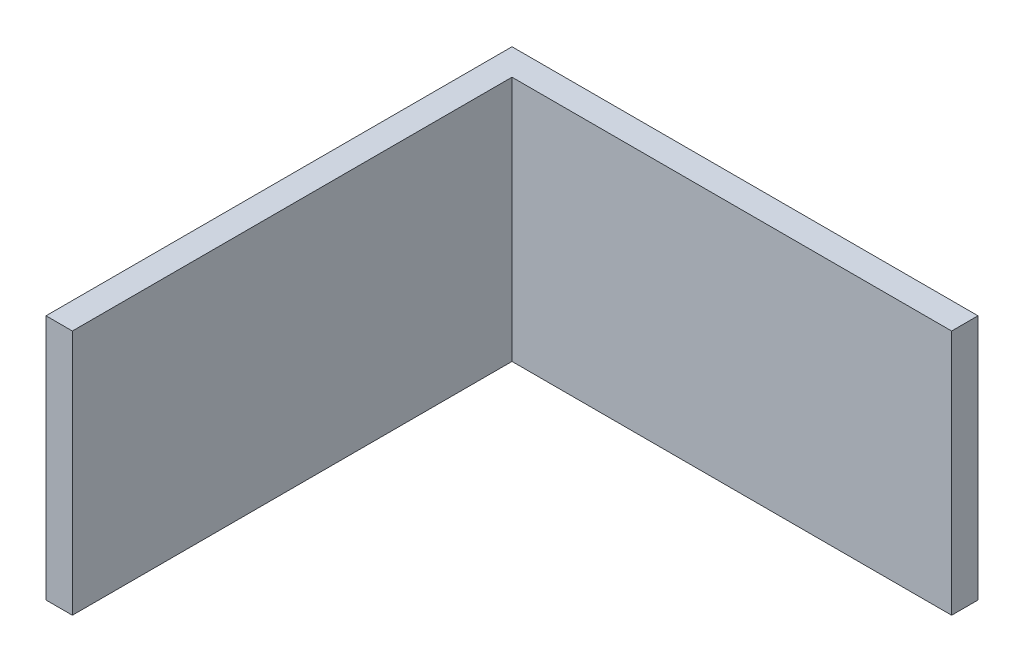
ISO-10303-21;
HEADER;
FILE_DESCRIPTION(('STEP AP214'),'2;1');
FILE_NAME('part.step','',(''),(''),'','','');
FILE_SCHEMA(('AUTOMOTIVE_DESIGN { 1 0 10303 214 1 1 1 1 }'));
ENDSEC;
DATA;
#1=APPLICATION_CONTEXT('core data for automotive mechanical design processes');
#2=APPLICATION_PROTOCOL_DEFINITION('international standard','automotive_design',2000,#1);
#3=PRODUCT_CONTEXT('',#1,'mechanical');
#4=PRODUCT('Part','Part','',(#3));
#5=PRODUCT_RELATED_PRODUCT_CATEGORY('part','',(#4));
#6=PRODUCT_DEFINITION_FORMATION('','',#4);
#7=PRODUCT_DEFINITION_CONTEXT('part definition',#1,'design');
#8=PRODUCT_DEFINITION('design','',#6,#7);
#9=PRODUCT_DEFINITION_SHAPE('','',#8);
#10=(LENGTH_UNIT() NAMED_UNIT(*) SI_UNIT(.MILLI.,.METRE.));
#11=(NAMED_UNIT(*) PLANE_ANGLE_UNIT() SI_UNIT($,.RADIAN.));
#12=(NAMED_UNIT(*) SI_UNIT($,.STERADIAN.) SOLID_ANGLE_UNIT());
#13=UNCERTAINTY_MEASURE_WITH_UNIT(LENGTH_MEASURE(1.E-05),#10,'distance_accuracy_value','');
#14=(GEOMETRIC_REPRESENTATION_CONTEXT(3) GLOBAL_UNCERTAINTY_ASSIGNED_CONTEXT((#13)) GLOBAL_UNIT_ASSIGNED_CONTEXT((#10,
#11,#12)) REPRESENTATION_CONTEXT('',''));
#15=CARTESIAN_POINT('',(0.,0.,0.));
#16=DIRECTION('',(0.,0.,1.));
#17=DIRECTION('',(1.,0.,0.));
#18=AXIS2_PLACEMENT_3D('',#15,#16,#17);
#19=CARTESIAN_POINT('',(0.,0.,1.5));
#20=DIRECTION('',(0.,0.,-1.));
#21=DIRECTION('',(-1.,0.,0.));
#22=AXIS2_PLACEMENT_3D('',#19,#20,#21);
#23=PLANE('',#22);
#24=DIRECTION('',(0.,1.,0.));
#25=VECTOR('',#24,1.);
#26=CARTESIAN_POINT('',(-11.75,-7.,1.5));
#27=LINE('',#26,#25);
#28=CARTESIAN_POINT('',(-11.75,-7.,1.5));
#29=VERTEX_POINT('',#28);
#30=CARTESIAN_POINT('',(-11.75,7.,1.5));
#31=VERTEX_POINT('',#30);
#32=EDGE_CURVE('E48',#29,#31,#27,.T.);
#33=ORIENTED_EDGE('',*,*,#32,.F.);
#34=DIRECTION('',(1.,0.,0.));
#35=VECTOR('',#34,1.);
#36=CARTESIAN_POINT('',(-13.25,-7.,1.5));
#37=LINE('',#36,#35);
#38=CARTESIAN_POINT('',(13.25,-7.,1.5));
#39=VERTEX_POINT('',#38);
#40=EDGE_CURVE('E53',#29,#39,#37,.T.);
#41=ORIENTED_EDGE('',*,*,#40,.T.);
#42=DIRECTION('',(0.,1.,0.));
#43=VECTOR('',#42,1.);
#44=CARTESIAN_POINT('',(13.25,-7.,1.5));
#45=LINE('',#44,#43);
#46=CARTESIAN_POINT('',(13.25,7.,1.5));
#47=VERTEX_POINT('',#46);
#48=EDGE_CURVE('E84',#39,#47,#45,.T.);
#49=ORIENTED_EDGE('',*,*,#48,.T.);
#50=DIRECTION('',(-1.,0.,0.));
#51=VECTOR('',#50,1.);
#52=CARTESIAN_POINT('',(-13.25,7.,1.5));
#53=LINE('',#52,#51);
#54=EDGE_CURVE('E134',#47,#31,#53,.T.);
#55=ORIENTED_EDGE('',*,*,#54,.T.);
#56=EDGE_LOOP('',(#33,#41,#49,#55));
#57=FACE_BOUND('',#56,.T.);
#58=ADVANCED_FACE('F33',(#57),#23,.F.);
#59=CARTESIAN_POINT('',(13.25,-7.,1.5));
#60=DIRECTION('',(-1.,0.,0.));
#61=DIRECTION('',(0.,0.,1.));
#62=AXIS2_PLACEMENT_3D('',#59,#60,#61);
#63=PLANE('',#62);
#64=DIRECTION('',(0.,1.,0.));
#65=VECTOR('',#64,1.);
#66=CARTESIAN_POINT('',(13.25,-7.,0.));
#67=LINE('',#66,#65);
#68=CARTESIAN_POINT('',(13.25,-7.,0.));
#69=VERTEX_POINT('',#68);
#70=CARTESIAN_POINT('',(13.25,7.,0.));
#71=VERTEX_POINT('',#70);
#72=EDGE_CURVE('E90',#69,#71,#67,.T.);
#73=ORIENTED_EDGE('',*,*,#72,.T.);
#74=DIRECTION('',(0.,0.,-1.));
#75=VECTOR('',#74,1.);
#76=CARTESIAN_POINT('',(13.25,7.,1.5));
#77=LINE('',#76,#75);
#78=EDGE_CURVE('E11',#47,#71,#77,.T.);
#79=ORIENTED_EDGE('',*,*,#78,.F.);
#80=ORIENTED_EDGE('',*,*,#48,.F.);
#81=DIRECTION('',(0.,0.,-1.));
#82=VECTOR('',#81,1.);
#83=CARTESIAN_POINT('',(13.25,-7.,1.5));
#84=LINE('',#83,#82);
#85=EDGE_CURVE('E76',#39,#69,#84,.T.);
#86=ORIENTED_EDGE('',*,*,#85,.T.);
#87=EDGE_LOOP('',(#73,#79,#80,#86));
#88=FACE_BOUND('',#87,.T.);
#89=ADVANCED_FACE('F35',(#88),#63,.F.);
#90=CARTESIAN_POINT('',(-13.25,7.,1.5));
#91=DIRECTION('',(0.,-1.,0.));
#92=DIRECTION('',(0.,0.,-1.));
#93=AXIS2_PLACEMENT_3D('',#90,#91,#92);
#94=PLANE('',#93);
#95=DIRECTION('',(-1.,0.,0.));
#96=VECTOR('',#95,1.);
#97=CARTESIAN_POINT('',(-13.25,7.,0.));
#98=LINE('',#97,#96);
#99=CARTESIAN_POINT('',(-13.25,7.,0.));
#100=VERTEX_POINT('',#99);
#101=EDGE_CURVE('E93',#71,#100,#98,.T.);
#102=ORIENTED_EDGE('',*,*,#101,.T.);
#103=DIRECTION('',(0.,0.,-1.));
#104=VECTOR('',#103,1.);
#105=CARTESIAN_POINT('',(-13.25,7.,1.5));
#106=LINE('',#105,#104);
#107=CARTESIAN_POINT('',(-13.25,7.,26.5));
#108=VERTEX_POINT('',#107);
#109=EDGE_CURVE('E41',#108,#100,#106,.T.);
#110=ORIENTED_EDGE('',*,*,#109,.F.);
#111=DIRECTION('',(-1.,0.,0.));
#112=VECTOR('',#111,1.);
#113=CARTESIAN_POINT('',(-13.25,7.,26.5));
#114=LINE('',#113,#112);
#115=CARTESIAN_POINT('',(-11.75,7.,26.5));
#116=VERTEX_POINT('',#115);
#117=EDGE_CURVE('E117',#116,#108,#114,.T.);
#118=ORIENTED_EDGE('',*,*,#117,.F.);
#119=DIRECTION('',(0.,0.,-1.));
#120=VECTOR('',#119,1.);
#121=CARTESIAN_POINT('',(-11.75,7.,26.5));
#122=LINE('',#121,#120);
#123=EDGE_CURVE('E98',#116,#31,#122,.T.);
#124=ORIENTED_EDGE('',*,*,#123,.T.);
#125=ORIENTED_EDGE('',*,*,#54,.F.);
#126=ORIENTED_EDGE('',*,*,#78,.T.);
#127=EDGE_LOOP('',(#102,#110,#118,#124,#125,#126));
#128=FACE_BOUND('',#127,.T.);
#129=ADVANCED_FACE('F114',(#128),#94,.F.);
#130=CARTESIAN_POINT('',(-13.25,-7.,1.5));
#131=DIRECTION('',(1.,0.,0.));
#132=DIRECTION('',(0.,0.,-1.));
#133=AXIS2_PLACEMENT_3D('',#130,#131,#132);
#134=PLANE('',#133);
#135=DIRECTION('',(0.,-1.,0.));
#136=VECTOR('',#135,1.);
#137=CARTESIAN_POINT('',(-13.25,-7.,0.));
#138=LINE('',#137,#136);
#139=CARTESIAN_POINT('',(-13.25,-7.,0.));
#140=VERTEX_POINT('',#139);
#141=EDGE_CURVE('E85',#100,#140,#138,.T.);
#142=ORIENTED_EDGE('',*,*,#141,.T.);
#143=DIRECTION('',(0.,0.,-1.));
#144=VECTOR('',#143,1.);
#145=CARTESIAN_POINT('',(-13.25,-7.,1.5));
#146=LINE('',#145,#144);
#147=CARTESIAN_POINT('',(-13.25,-7.,26.5));
#148=VERTEX_POINT('',#147);
#149=EDGE_CURVE('E80',#148,#140,#146,.T.);
#150=ORIENTED_EDGE('',*,*,#149,.F.);
#151=DIRECTION('',(0.,-1.,0.));
#152=VECTOR('',#151,1.);
#153=CARTESIAN_POINT('',(-13.25,-7.,26.5));
#154=LINE('',#153,#152);
#155=EDGE_CURVE('E110',#108,#148,#154,.T.);
#156=ORIENTED_EDGE('',*,*,#155,.F.);
#157=ORIENTED_EDGE('',*,*,#109,.T.);
#158=EDGE_LOOP('',(#142,#150,#156,#157));
#159=FACE_BOUND('',#158,.T.);
#160=ADVANCED_FACE('F108',(#159),#134,.F.);
#161=CARTESIAN_POINT('',(-13.25,-7.,1.5));
#162=DIRECTION('',(0.,1.,0.));
#163=DIRECTION('',(0.,0.,1.));
#164=AXIS2_PLACEMENT_3D('',#161,#162,#163);
#165=PLANE('',#164);
#166=DIRECTION('',(1.,0.,0.));
#167=VECTOR('',#166,1.);
#168=CARTESIAN_POINT('',(-13.25,-7.,0.));
#169=LINE('',#168,#167);
#170=EDGE_CURVE('E73',#140,#69,#169,.T.);
#171=ORIENTED_EDGE('',*,*,#170,.T.);
#172=ORIENTED_EDGE('',*,*,#85,.F.);
#173=ORIENTED_EDGE('',*,*,#40,.F.);
#174=DIRECTION('',(0.,0.,-1.));
#175=VECTOR('',#174,1.);
#176=CARTESIAN_POINT('',(-11.75,-7.,26.5));
#177=LINE('',#176,#175);
#178=CARTESIAN_POINT('',(-11.75,-7.,26.5));
#179=VERTEX_POINT('',#178);
#180=EDGE_CURVE('E94',#179,#29,#177,.T.);
#181=ORIENTED_EDGE('',*,*,#180,.F.);
#182=DIRECTION('',(1.,0.,0.));
#183=VECTOR('',#182,1.);
#184=CARTESIAN_POINT('',(-13.25,-7.,26.5));
#185=LINE('',#184,#183);
#186=EDGE_CURVE('E129',#148,#179,#185,.T.);
#187=ORIENTED_EDGE('',*,*,#186,.F.);
#188=ORIENTED_EDGE('',*,*,#149,.T.);
#189=EDGE_LOOP('',(#171,#172,#173,#181,#187,#188));
#190=FACE_BOUND('',#189,.T.);
#191=ADVANCED_FACE('F75',(#190),#165,.F.);
#192=CARTESIAN_POINT('',(0.,0.,0.));
#193=DIRECTION('',(0.,0.,-1.));
#194=DIRECTION('',(-1.,0.,0.));
#195=AXIS2_PLACEMENT_3D('',#192,#193,#194);
#196=PLANE('',#195);
#197=ORIENTED_EDGE('',*,*,#72,.F.);
#198=ORIENTED_EDGE('',*,*,#170,.F.);
#199=ORIENTED_EDGE('',*,*,#141,.F.);
#200=ORIENTED_EDGE('',*,*,#101,.F.);
#201=EDGE_LOOP('',(#197,#198,#199,#200));
#202=FACE_BOUND('',#201,.T.);
#203=ADVANCED_FACE('F92',(#202),#196,.T.);
#204=CARTESIAN_POINT('',(-11.75,-7.,26.5));
#205=DIRECTION('',(-1.,0.,0.));
#206=DIRECTION('',(0.,0.,1.));
#207=AXIS2_PLACEMENT_3D('',#204,#205,#206);
#208=PLANE('',#207);
#209=ORIENTED_EDGE('',*,*,#32,.T.);
#210=ORIENTED_EDGE('',*,*,#123,.F.);
#211=DIRECTION('',(0.,1.,0.));
#212=VECTOR('',#211,1.);
#213=CARTESIAN_POINT('',(-11.75,-7.,26.5));
#214=LINE('',#213,#212);
#215=EDGE_CURVE('E125',#179,#116,#214,.T.);
#216=ORIENTED_EDGE('',*,*,#215,.F.);
#217=ORIENTED_EDGE('',*,*,#180,.T.);
#218=EDGE_LOOP('',(#209,#210,#216,#217));
#219=FACE_BOUND('',#218,.T.);
#220=ADVANCED_FACE('F137',(#219),#208,.F.);
#221=CARTESIAN_POINT('',(0.,0.,26.5));
#222=DIRECTION('',(0.,0.,-1.));
#223=DIRECTION('',(-1.,0.,0.));
#224=AXIS2_PLACEMENT_3D('',#221,#222,#223);
#225=PLANE('',#224);
#226=ORIENTED_EDGE('',*,*,#155,.T.);
#227=ORIENTED_EDGE('',*,*,#186,.T.);
#228=ORIENTED_EDGE('',*,*,#215,.T.);
#229=ORIENTED_EDGE('',*,*,#117,.T.);
#230=EDGE_LOOP('',(#226,#227,#228,#229));
#231=FACE_BOUND('',#230,.T.);
#232=ADVANCED_FACE('F121',(#231),#225,.F.);
#233=CLOSED_SHELL('',(#58,#89,#129,#160,#191,#203,#220,#232));
#234=MANIFOLD_SOLID_BREP('B2',#233);
#235=ADVANCED_BREP_SHAPE_REPRESENTATION('',(#18,#234),#14);
#236=SHAPE_DEFINITION_REPRESENTATION(#9,#235);
ENDSEC;
END-ISO-10303-21;
